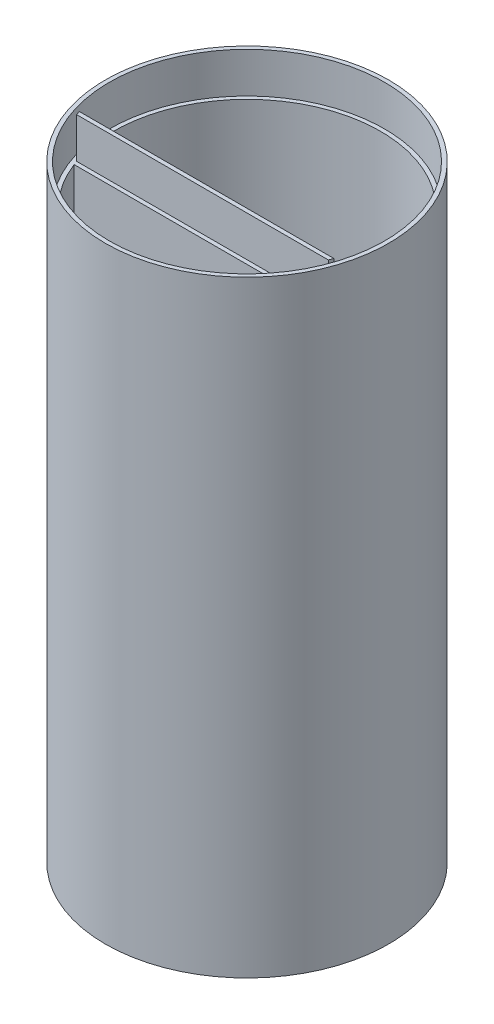
ISO-10303-21;
HEADER;
FILE_DESCRIPTION(('STEP AP214'),'2;1');
FILE_NAME('part.step','',(''),(''),'','','');
FILE_SCHEMA(('AUTOMOTIVE_DESIGN { 1 0 10303 214 1 1 1 1 }'));
ENDSEC;
DATA;
#1=APPLICATION_CONTEXT('core data for automotive mechanical design processes');
#2=APPLICATION_PROTOCOL_DEFINITION('international standard','automotive_design',2000,#1);
#3=PRODUCT_CONTEXT('',#1,'mechanical');
#4=PRODUCT('Part','Part','',(#3));
#5=PRODUCT_RELATED_PRODUCT_CATEGORY('part','',(#4));
#6=PRODUCT_DEFINITION_FORMATION('','',#4);
#7=PRODUCT_DEFINITION_CONTEXT('part definition',#1,'design');
#8=PRODUCT_DEFINITION('design','',#6,#7);
#9=PRODUCT_DEFINITION_SHAPE('','',#8);
#10=(LENGTH_UNIT() NAMED_UNIT(*) SI_UNIT(.MILLI.,.METRE.));
#11=(NAMED_UNIT(*) PLANE_ANGLE_UNIT() SI_UNIT($,.RADIAN.));
#12=(NAMED_UNIT(*) SI_UNIT($,.STERADIAN.) SOLID_ANGLE_UNIT());
#13=UNCERTAINTY_MEASURE_WITH_UNIT(LENGTH_MEASURE(1.E-05),#10,'distance_accuracy_value','');
#14=(GEOMETRIC_REPRESENTATION_CONTEXT(3) GLOBAL_UNCERTAINTY_ASSIGNED_CONTEXT((#13)) GLOBAL_UNIT_ASSIGNED_CONTEXT((#10,
#11,#12)) REPRESENTATION_CONTEXT('',''));
#15=CARTESIAN_POINT('',(0.,0.,0.));
#16=DIRECTION('',(0.,0.,1.));
#17=DIRECTION('',(1.,0.,0.));
#18=AXIS2_PLACEMENT_3D('',#15,#16,#17);
#19=CARTESIAN_POINT('',(0.,150.,0.));
#20=DIRECTION('',(0.,1.,0.));
#21=DIRECTION('',(0.,0.,1.));
#22=AXIS2_PLACEMENT_3D('',#19,#20,#21);
#23=PLANE('',#22);
#24=DIRECTION('',(1.,0.,0.));
#25=VECTOR('',#24,1.);
#26=CARTESIAN_POINT('',(0.,150.,11.));
#27=LINE('',#26,#25);
#28=CARTESIAN_POINT('',(-31.1126983722081,150.,11.));
#29=VERTEX_POINT('',#28);
#30=CARTESIAN_POINT('',(31.1126983722081,150.,11.));
#31=VERTEX_POINT('',#30);
#32=EDGE_CURVE('E132',#29,#31,#27,.T.);
#33=ORIENTED_EDGE('',*,*,#32,.T.);
#34=CARTESIAN_POINT('',(0.,150.,0.));
#35=DIRECTION('',(0.,1.,0.));
#36=DIRECTION('',(0.,0.,1.));
#37=AXIS2_PLACEMENT_3D('',#34,#35,#36);
#38=CIRCLE('',#37,33.);
#39=CARTESIAN_POINT('',(31.4483703870328,150.,10.));
#40=VERTEX_POINT('',#39);
#41=EDGE_CURVE('E112',#31,#40,#38,.T.);
#42=ORIENTED_EDGE('',*,*,#41,.T.);
#43=DIRECTION('',(1.,0.,0.));
#44=VECTOR('',#43,1.);
#45=CARTESIAN_POINT('',(-31.4483703870328,150.,10.));
#46=LINE('',#45,#44);
#47=CARTESIAN_POINT('',(-31.4483703870328,150.,10.));
#48=VERTEX_POINT('',#47);
#49=EDGE_CURVE('E149',#48,#40,#46,.T.);
#50=ORIENTED_EDGE('',*,*,#49,.F.);
#51=EDGE_CURVE('E133',#48,#29,#38,.T.);
#52=ORIENTED_EDGE('',*,*,#51,.T.);
#53=EDGE_LOOP('',(#33,#42,#50,#52));
#54=FACE_BOUND('',#53,.T.);
#55=ADVANCED_FACE('F41',(#54),#23,.T.);
#56=CARTESIAN_POINT('',(0.,150.,0.));
#57=DIRECTION('',(0.,-1.,0.));
#58=DIRECTION('',(0.,0.,-1.));
#59=AXIS2_PLACEMENT_3D('',#56,#57,#58);
#60=CYLINDRICAL_SURFACE('',#59,33.);
#61=DIRECTION('',(0.,-1.,0.));
#62=VECTOR('',#61,1.);
#63=CARTESIAN_POINT('',(31.4483703870328,150.,10.));
#64=LINE('',#63,#62);
#65=CARTESIAN_POINT('',(31.4483703870328,140.,10.));
#66=VERTEX_POINT('',#65);
#67=CARTESIAN_POINT('',(31.4483703870328,0.,10.));
#68=VERTEX_POINT('',#67);
#69=EDGE_CURVE('E152',#66,#68,#64,.T.);
#70=ORIENTED_EDGE('',*,*,#69,.F.);
#71=CARTESIAN_POINT('',(0.,140.,0.));
#72=DIRECTION('',(0.,1.,0.));
#73=DIRECTION('',(0.,0.,1.));
#74=AXIS2_PLACEMENT_3D('',#71,#72,#73);
#75=CIRCLE('',#74,33.);
#76=CARTESIAN_POINT('',(-31.4483703870328,140.,10.));
#77=VERTEX_POINT('',#76);
#78=EDGE_CURVE('E118',#66,#77,#75,.T.);
#79=ORIENTED_EDGE('',*,*,#78,.T.);
#80=DIRECTION('',(0.,-1.,0.));
#81=VECTOR('',#80,1.);
#82=CARTESIAN_POINT('',(-31.4483703870328,150.,10.));
#83=LINE('',#82,#81);
#84=CARTESIAN_POINT('',(-31.4483703870328,0.,10.));
#85=VERTEX_POINT('',#84);
#86=EDGE_CURVE('E161',#77,#85,#83,.T.);
#87=ORIENTED_EDGE('',*,*,#86,.T.);
#88=CARTESIAN_POINT('',(0.,0.,0.));
#89=DIRECTION('',(0.,1.,0.));
#90=DIRECTION('',(0.,0.,1.));
#91=AXIS2_PLACEMENT_3D('',#88,#89,#90);
#92=CIRCLE('',#91,33.);
#93=EDGE_CURVE('E148',#68,#85,#92,.T.);
#94=ORIENTED_EDGE('',*,*,#93,.F.);
#95=EDGE_LOOP('',(#70,#79,#87,#94));
#96=FACE_BOUND('',#95,.T.);
#97=ADVANCED_FACE('F170',(#96),#60,.F.);
#98=CARTESIAN_POINT('',(0.,150.,0.));
#99=DIRECTION('',(0.,-1.,0.));
#100=DIRECTION('',(0.,0.,-1.));
#101=AXIS2_PLACEMENT_3D('',#98,#99,#100);
#102=CYLINDRICAL_SURFACE('',#101,33.);
#103=DIRECTION('',(0.,-1.,0.));
#104=VECTOR('',#103,1.);
#105=CARTESIAN_POINT('',(-30.7408522978788,150.,12.));
#106=LINE('',#105,#104);
#107=CARTESIAN_POINT('',(-30.7408522978788,140.,12.));
#108=VERTEX_POINT('',#107);
#109=CARTESIAN_POINT('',(-30.7408522978788,0.,12.));
#110=VERTEX_POINT('',#109);
#111=EDGE_CURVE('E144',#108,#110,#106,.T.);
#112=ORIENTED_EDGE('',*,*,#111,.F.);
#113=CARTESIAN_POINT('',(30.7408522978788,140.,12.));
#114=VERTEX_POINT('',#113);
#115=EDGE_CURVE('E63',#108,#114,#75,.T.);
#116=ORIENTED_EDGE('',*,*,#115,.T.);
#117=DIRECTION('',(0.,-1.,0.));
#118=VECTOR('',#117,1.);
#119=CARTESIAN_POINT('',(30.7408522978788,150.,12.));
#120=LINE('',#119,#118);
#121=CARTESIAN_POINT('',(30.7408522978788,0.,12.));
#122=VERTEX_POINT('',#121);
#123=EDGE_CURVE('E146',#114,#122,#120,.T.);
#124=ORIENTED_EDGE('',*,*,#123,.T.);
#125=CARTESIAN_POINT('',(0.,0.,0.));
#126=DIRECTION('',(0.,1.,0.));
#127=DIRECTION('',(0.,0.,1.));
#128=AXIS2_PLACEMENT_3D('',#125,#126,#127);
#129=CIRCLE('',#128,33.);
#130=EDGE_CURVE('E137',#110,#122,#129,.T.);
#131=ORIENTED_EDGE('',*,*,#130,.F.);
#132=EDGE_LOOP('',(#112,#116,#124,#131));
#133=FACE_BOUND('',#132,.T.);
#134=ADVANCED_FACE('F182',(#133),#102,.F.);
#135=CARTESIAN_POINT('',(-30.7408522978788,150.,12.));
#136=DIRECTION('',(0.,0.,1.));
#137=DIRECTION('',(1.,0.,0.));
#138=AXIS2_PLACEMENT_3D('',#135,#136,#137);
#139=PLANE('',#138);
#140=ORIENTED_EDGE('',*,*,#123,.F.);
#141=DIRECTION('',(1.,0.,0.));
#142=VECTOR('',#141,1.);
#143=CARTESIAN_POINT('',(0.,140.,12.));
#144=LINE('',#143,#142);
#145=EDGE_CURVE('E123',#108,#114,#144,.T.);
#146=ORIENTED_EDGE('',*,*,#145,.F.);
#147=ORIENTED_EDGE('',*,*,#111,.T.);
#148=DIRECTION('',(-1.,0.,0.));
#149=VECTOR('',#148,1.);
#150=CARTESIAN_POINT('',(-30.7408522978788,0.,12.));
#151=LINE('',#150,#149);
#152=EDGE_CURVE('E141',#122,#110,#151,.T.);
#153=ORIENTED_EDGE('',*,*,#152,.F.);
#154=EDGE_LOOP('',(#140,#146,#147,#153));
#155=FACE_BOUND('',#154,.T.);
#156=ADVANCED_FACE('F184',(#155),#139,.T.);
#157=CARTESIAN_POINT('',(0.,150.,0.));
#158=DIRECTION('',(0.,1.,0.));
#159=DIRECTION('',(0.,0.,1.));
#160=AXIS2_PLACEMENT_3D('',#157,#158,#159);
#161=CIRCLE('',#160,34.);
#162=CARTESIAN_POINT('',(0.,150.,34.));
#163=VERTEX_POINT('',#162);
#164=EDGE_CURVE('E122',#163,#163,#161,.T.);
#165=ORIENTED_EDGE('',*,*,#164,.F.);
#166=EDGE_LOOP('',(#165));
#167=FACE_BOUND('',#166,.T.);
#168=CARTESIAN_POINT('',(0.,150.,0.));
#169=DIRECTION('',(0.,1.,0.));
#170=DIRECTION('',(0.,0.,1.));
#171=AXIS2_PLACEMENT_3D('',#168,#169,#170);
#172=CIRCLE('',#171,35.);
#173=CARTESIAN_POINT('',(0.,150.,35.));
#174=VERTEX_POINT('',#173);
#175=EDGE_CURVE('E11',#174,#174,#172,.T.);
#176=ORIENTED_EDGE('',*,*,#175,.T.);
#177=EDGE_LOOP('',(#176));
#178=FACE_BOUND('',#177,.T.);
#179=ADVANCED_FACE('F177',(#167,#178),#23,.T.);
#180=CARTESIAN_POINT('',(0.,0.,0.));
#181=DIRECTION('',(0.,1.,0.));
#182=DIRECTION('',(0.,0.,1.));
#183=AXIS2_PLACEMENT_3D('',#180,#181,#182);
#184=PLANE('',#183);
#185=ORIENTED_EDGE('',*,*,#93,.T.);
#186=DIRECTION('',(1.,0.,0.));
#187=VECTOR('',#186,1.);
#188=CARTESIAN_POINT('',(-31.4483703870328,0.,10.));
#189=LINE('',#188,#187);
#190=EDGE_CURVE('E153',#85,#68,#189,.T.);
#191=ORIENTED_EDGE('',*,*,#190,.T.);
#192=EDGE_LOOP('',(#185,#191));
#193=FACE_BOUND('',#192,.T.);
#194=CARTESIAN_POINT('',(0.,0.,0.));
#195=DIRECTION('',(0.,1.,0.));
#196=DIRECTION('',(0.,0.,1.));
#197=AXIS2_PLACEMENT_3D('',#194,#195,#196);
#198=CIRCLE('',#197,35.);
#199=CARTESIAN_POINT('',(0.,0.,35.));
#200=VERTEX_POINT('',#199);
#201=EDGE_CURVE('E45',#200,#200,#198,.T.);
#202=ORIENTED_EDGE('',*,*,#201,.F.);
#203=EDGE_LOOP('',(#202));
#204=FACE_BOUND('',#203,.T.);
#205=ORIENTED_EDGE('',*,*,#130,.T.);
#206=ORIENTED_EDGE('',*,*,#152,.T.);
#207=EDGE_LOOP('',(#205,#206));
#208=FACE_BOUND('',#207,.T.);
#209=ADVANCED_FACE('F174',(#193,#204,#208),#184,.F.);
#210=CARTESIAN_POINT('',(0.,150.,0.));
#211=DIRECTION('',(0.,-1.,0.));
#212=DIRECTION('',(0.,0.,-1.));
#213=AXIS2_PLACEMENT_3D('',#210,#211,#212);
#214=CYLINDRICAL_SURFACE('',#213,35.);
#215=ORIENTED_EDGE('',*,*,#175,.F.);
#216=EDGE_LOOP('',(#215));
#217=FACE_BOUND('',#216,.T.);
#218=ORIENTED_EDGE('',*,*,#201,.T.);
#219=EDGE_LOOP('',(#218));
#220=FACE_BOUND('',#219,.T.);
#221=ADVANCED_FACE('F43',(#217,#220),#214,.T.);
#222=CARTESIAN_POINT('',(-31.4483703870328,150.,10.));
#223=DIRECTION('',(0.,0.,-1.));
#224=DIRECTION('',(-1.,0.,0.));
#225=AXIS2_PLACEMENT_3D('',#222,#223,#224);
#226=PLANE('',#225);
#227=ORIENTED_EDGE('',*,*,#190,.F.);
#228=ORIENTED_EDGE('',*,*,#86,.F.);
#229=EDGE_CURVE('E162',#48,#77,#83,.T.);
#230=ORIENTED_EDGE('',*,*,#229,.F.);
#231=ORIENTED_EDGE('',*,*,#49,.T.);
#232=EDGE_CURVE('E158',#40,#66,#64,.T.);
#233=ORIENTED_EDGE('',*,*,#232,.T.);
#234=ORIENTED_EDGE('',*,*,#69,.T.);
#235=EDGE_LOOP('',(#227,#228,#230,#231,#233,#234));
#236=FACE_BOUND('',#235,.T.);
#237=ADVANCED_FACE('F172',(#236),#226,.T.);
#238=CARTESIAN_POINT('',(0.,140.,0.));
#239=DIRECTION('',(0.,1.,0.));
#240=DIRECTION('',(0.,0.,1.));
#241=AXIS2_PLACEMENT_3D('',#238,#239,#240);
#242=CYLINDRICAL_SURFACE('',#241,33.);
#243=CARTESIAN_POINT('',(-31.1126983722081,140.,11.));
#244=VERTEX_POINT('',#243);
#245=EDGE_CURVE('E121',#77,#244,#75,.T.);
#246=ORIENTED_EDGE('',*,*,#245,.T.);
#247=DIRECTION('',(0.,1.,0.));
#248=VECTOR('',#247,1.);
#249=CARTESIAN_POINT('',(-31.1126983722081,140.,11.));
#250=LINE('',#249,#248);
#251=EDGE_CURVE('E106',#244,#29,#250,.T.);
#252=ORIENTED_EDGE('',*,*,#251,.T.);
#253=ORIENTED_EDGE('',*,*,#51,.F.);
#254=ORIENTED_EDGE('',*,*,#229,.T.);
#255=EDGE_LOOP('',(#246,#252,#253,#254));
#256=FACE_BOUND('',#255,.T.);
#257=ADVANCED_FACE('F203',(#256),#242,.T.);
#258=ORIENTED_EDGE('',*,*,#41,.F.);
#259=DIRECTION('',(0.,1.,0.));
#260=VECTOR('',#259,1.);
#261=CARTESIAN_POINT('',(31.1126983722081,140.,11.));
#262=LINE('',#261,#260);
#263=CARTESIAN_POINT('',(31.1126983722081,140.,11.));
#264=VERTEX_POINT('',#263);
#265=EDGE_CURVE('E103',#264,#31,#262,.T.);
#266=ORIENTED_EDGE('',*,*,#265,.F.);
#267=EDGE_CURVE('E56',#264,#66,#75,.T.);
#268=ORIENTED_EDGE('',*,*,#267,.T.);
#269=ORIENTED_EDGE('',*,*,#232,.F.);
#270=EDGE_LOOP('',(#258,#266,#268,#269));
#271=FACE_BOUND('',#270,.T.);
#272=ADVANCED_FACE('F110',(#271),#242,.T.);
#273=CARTESIAN_POINT('',(0.,140.,11.));
#274=DIRECTION('',(0.,0.,1.));
#275=DIRECTION('',(1.,0.,0.));
#276=AXIS2_PLACEMENT_3D('',#273,#274,#275);
#277=PLANE('',#276);
#278=ORIENTED_EDGE('',*,*,#32,.F.);
#279=ORIENTED_EDGE('',*,*,#251,.F.);
#280=DIRECTION('',(1.,0.,0.));
#281=VECTOR('',#280,1.);
#282=CARTESIAN_POINT('',(0.,140.,11.));
#283=LINE('',#282,#281);
#284=EDGE_CURVE('E101',#244,#264,#283,.T.);
#285=ORIENTED_EDGE('',*,*,#284,.T.);
#286=ORIENTED_EDGE('',*,*,#265,.T.);
#287=EDGE_LOOP('',(#278,#279,#285,#286));
#288=FACE_BOUND('',#287,.T.);
#289=ADVANCED_FACE('F102',(#288),#277,.T.);
#290=CARTESIAN_POINT('',(0.,140.,0.));
#291=DIRECTION('',(0.,1.,0.));
#292=DIRECTION('',(0.,0.,1.));
#293=AXIS2_PLACEMENT_3D('',#290,#291,#292);
#294=CYLINDRICAL_SURFACE('',#293,34.);
#295=CARTESIAN_POINT('',(0.,140.,0.));
#296=DIRECTION('',(0.,1.,0.));
#297=DIRECTION('',(0.,0.,1.));
#298=AXIS2_PLACEMENT_3D('',#295,#296,#297);
#299=CIRCLE('',#298,34.);
#300=CARTESIAN_POINT('',(0.,140.,34.));
#301=VERTEX_POINT('',#300);
#302=EDGE_CURVE('E114',#301,#301,#299,.T.);
#303=ORIENTED_EDGE('',*,*,#302,.F.);
#304=EDGE_LOOP('',(#303));
#305=FACE_BOUND('',#304,.T.);
#306=ORIENTED_EDGE('',*,*,#164,.T.);
#307=EDGE_LOOP('',(#306));
#308=FACE_BOUND('',#307,.T.);
#309=ADVANCED_FACE('F258',(#305,#308),#294,.F.);
#310=CARTESIAN_POINT('',(0.,140.,0.));
#311=DIRECTION('',(0.,1.,0.));
#312=DIRECTION('',(0.,0.,1.));
#313=AXIS2_PLACEMENT_3D('',#310,#311,#312);
#314=PLANE('',#313);
#315=ORIENTED_EDGE('',*,*,#267,.F.);
#316=ORIENTED_EDGE('',*,*,#284,.F.);
#317=ORIENTED_EDGE('',*,*,#245,.F.);
#318=ORIENTED_EDGE('',*,*,#78,.F.);
#319=EDGE_LOOP('',(#315,#316,#317,#318));
#320=FACE_BOUND('',#319,.T.);
#321=ORIENTED_EDGE('',*,*,#115,.F.);
#322=ORIENTED_EDGE('',*,*,#145,.T.);
#323=EDGE_LOOP('',(#321,#322));
#324=FACE_BOUND('',#323,.T.);
#325=ORIENTED_EDGE('',*,*,#302,.T.);
#326=EDGE_LOOP('',(#325));
#327=FACE_BOUND('',#326,.T.);
#328=ADVANCED_FACE('F116',(#320,#324,#327),#314,.T.);
#329=CLOSED_SHELL('',(#55,#97,#134,#156,#179,#209,#221,#237,#257,#272,#289,#309,#328));
#330=MANIFOLD_SOLID_BREP('B2',#329);
#331=ADVANCED_BREP_SHAPE_REPRESENTATION('',(#18,#330),#14);
#332=SHAPE_DEFINITION_REPRESENTATION(#9,#331);
ENDSEC;
END-ISO-10303-21;
